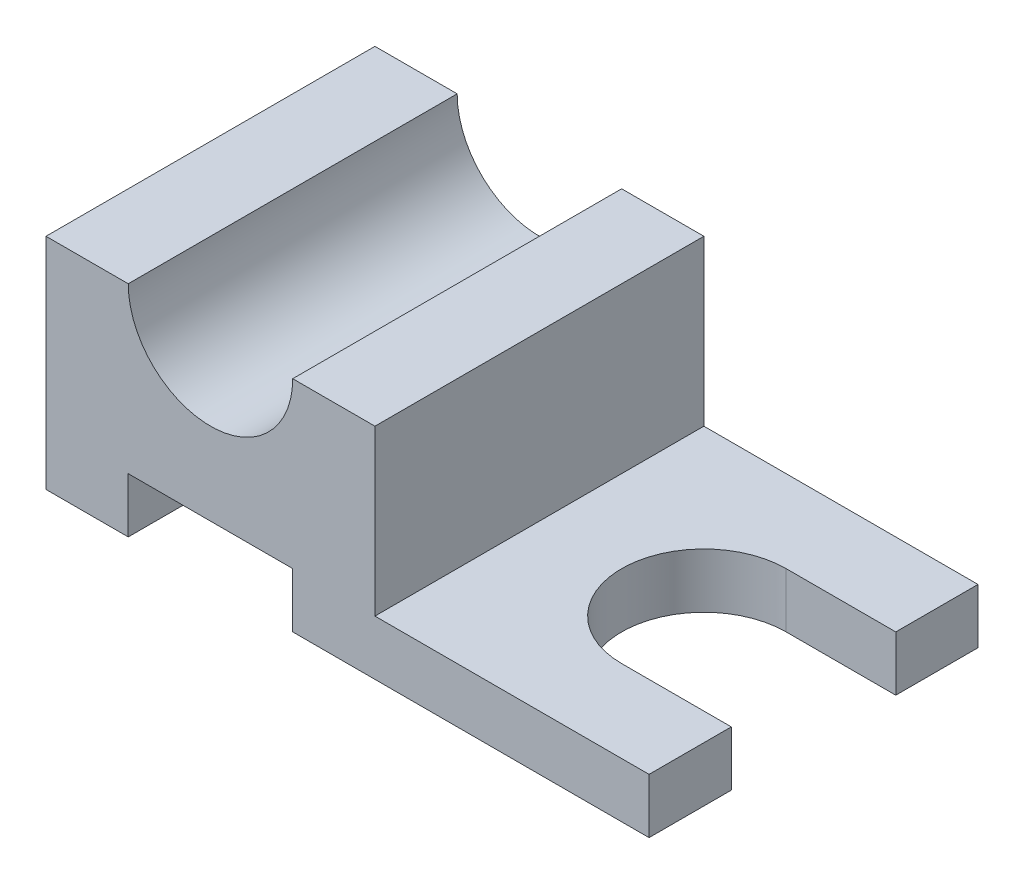
ISO-10303-21;
HEADER;
FILE_DESCRIPTION(('STEP AP214'),'2;1');
FILE_NAME('part.step','',(''),(''),'','','');
FILE_SCHEMA(('AUTOMOTIVE_DESIGN { 1 0 10303 214 1 1 1 1 }'));
ENDSEC;
DATA;
#1=APPLICATION_CONTEXT('core data for automotive mechanical design processes');
#2=APPLICATION_PROTOCOL_DEFINITION('international standard','automotive_design',2000,#1);
#3=PRODUCT_CONTEXT('',#1,'mechanical');
#4=PRODUCT('Part','Part','',(#3));
#5=PRODUCT_RELATED_PRODUCT_CATEGORY('part','',(#4));
#6=PRODUCT_DEFINITION_FORMATION('','',#4);
#7=PRODUCT_DEFINITION_CONTEXT('part definition',#1,'design');
#8=PRODUCT_DEFINITION('design','',#6,#7);
#9=PRODUCT_DEFINITION_SHAPE('','',#8);
#10=(LENGTH_UNIT() NAMED_UNIT(*) SI_UNIT(.MILLI.,.METRE.));
#11=(NAMED_UNIT(*) PLANE_ANGLE_UNIT() SI_UNIT($,.RADIAN.));
#12=(NAMED_UNIT(*) SI_UNIT($,.STERADIAN.) SOLID_ANGLE_UNIT());
#13=UNCERTAINTY_MEASURE_WITH_UNIT(LENGTH_MEASURE(1.E-05),#10,'distance_accuracy_value','');
#14=(GEOMETRIC_REPRESENTATION_CONTEXT(3) GLOBAL_UNCERTAINTY_ASSIGNED_CONTEXT((#13)) GLOBAL_UNIT_ASSIGNED_CONTEXT((#10,
#11,#12)) REPRESENTATION_CONTEXT('',''));
#15=CARTESIAN_POINT('',(0.,0.,0.));
#16=DIRECTION('',(0.,0.,1.));
#17=DIRECTION('',(1.,0.,0.));
#18=AXIS2_PLACEMENT_3D('',#15,#16,#17);
#19=CARTESIAN_POINT('',(-4.17454601462801,0.,60.));
#20=DIRECTION('',(-1.,0.,0.));
#21=DIRECTION('',(0.,0.,1.));
#22=AXIS2_PLACEMENT_3D('',#19,#20,#21);
#23=PLANE('',#22);
#24=DIRECTION('',(0.,0.,-1.));
#25=VECTOR('',#24,1.);
#26=CARTESIAN_POINT('',(-4.17454601462801,-48.7241840612872,60.));
#27=LINE('',#26,#25);
#28=CARTESIAN_POINT('',(-4.17454601462801,-48.7241840612872,15.));
#29=VERTEX_POINT('',#28);
#30=CARTESIAN_POINT('',(-4.17454601462801,-48.7241840612872,0.));
#31=VERTEX_POINT('',#30);
#32=EDGE_CURVE('E156',#29,#31,#27,.T.);
#33=ORIENTED_EDGE('',*,*,#32,.F.);
#34=DIRECTION('',(0.,1.,0.));
#35=VECTOR('',#34,1.);
#36=CARTESIAN_POINT('',(-4.17454601462801,-58.7241840612872,15.));
#37=LINE('',#36,#35);
#38=CARTESIAN_POINT('',(-4.17454601462801,-58.7241840612872,15.));
#39=VERTEX_POINT('',#38);
#40=EDGE_CURVE('E292',#39,#29,#37,.T.);
#41=ORIENTED_EDGE('',*,*,#40,.F.);
#42=DIRECTION('',(0.,0.,-1.));
#43=VECTOR('',#42,1.);
#44=CARTESIAN_POINT('',(-4.17454601462801,-58.7241840612872,60.));
#45=LINE('',#44,#43);
#46=CARTESIAN_POINT('',(-4.17454601462801,-58.7241840612872,0.));
#47=VERTEX_POINT('',#46);
#48=EDGE_CURVE('E201',#39,#47,#45,.T.);
#49=ORIENTED_EDGE('',*,*,#48,.T.);
#50=DIRECTION('',(0.,1.,0.));
#51=VECTOR('',#50,1.);
#52=CARTESIAN_POINT('',(-4.17454601462801,0.,0.));
#53=LINE('',#52,#51);
#54=EDGE_CURVE('E187',#47,#31,#53,.T.);
#55=ORIENTED_EDGE('',*,*,#54,.T.);
#56=EDGE_LOOP('',(#33,#41,#49,#55));
#57=FACE_BOUND('',#56,.T.);
#58=ADVANCED_FACE('F34',(#57),#23,.F.);
#59=CARTESIAN_POINT('',(-84.174546014628,-18.7241840612872,60.));
#60=DIRECTION('',(0.,0.,-1.));
#61=DIRECTION('',(-1.,0.,0.));
#62=AXIS2_PLACEMENT_3D('',#59,#60,#61);
#63=CYLINDRICAL_SURFACE('',#62,15.);
#64=CARTESIAN_POINT('',(-84.174546014628,-18.7241840612872,0.));
#65=DIRECTION('',(0.,0.,1.));
#66=DIRECTION('',(1.,0.,0.));
#67=AXIS2_PLACEMENT_3D('',#64,#65,#66);
#68=CIRCLE('',#67,15.);
#69=CARTESIAN_POINT('',(-99.174546014628,-18.7241840612872,0.));
#70=VERTEX_POINT('',#69);
#71=CARTESIAN_POINT('',(-69.174546014628,-18.7241840612872,0.));
#72=VERTEX_POINT('',#71);
#73=EDGE_CURVE('E165',#70,#72,#68,.T.);
#74=ORIENTED_EDGE('',*,*,#73,.F.);
#75=DIRECTION('',(0.,0.,-1.));
#76=VECTOR('',#75,1.);
#77=CARTESIAN_POINT('',(-99.174546014628,-18.7241840612872,60.));
#78=LINE('',#77,#76);
#79=CARTESIAN_POINT('',(-99.174546014628,-18.7241840612872,60.));
#80=VERTEX_POINT('',#79);
#81=EDGE_CURVE('E11',#80,#70,#78,.T.);
#82=ORIENTED_EDGE('',*,*,#81,.F.);
#83=CARTESIAN_POINT('',(-84.174546014628,-18.7241840612872,60.));
#84=DIRECTION('',(0.,0.,1.));
#85=DIRECTION('',(1.,0.,0.));
#86=AXIS2_PLACEMENT_3D('',#83,#84,#85);
#87=CIRCLE('',#86,15.);
#88=CARTESIAN_POINT('',(-69.174546014628,-18.7241840612872,60.));
#89=VERTEX_POINT('',#88);
#90=EDGE_CURVE('E196',#80,#89,#87,.T.);
#91=ORIENTED_EDGE('',*,*,#90,.T.);
#92=DIRECTION('',(0.,0.,-1.));
#93=VECTOR('',#92,1.);
#94=CARTESIAN_POINT('',(-69.174546014628,-18.7241840612872,60.));
#95=LINE('',#94,#93);
#96=EDGE_CURVE('E58',#89,#72,#95,.T.);
#97=ORIENTED_EDGE('',*,*,#96,.T.);
#98=EDGE_LOOP('',(#74,#82,#91,#97));
#99=FACE_BOUND('',#98,.T.);
#100=ADVANCED_FACE('F36',(#99),#63,.F.);
#101=CARTESIAN_POINT('',(0.,-18.7241840612872,60.));
#102=DIRECTION('',(0.,1.,0.));
#103=DIRECTION('',(0.,0.,1.));
#104=AXIS2_PLACEMENT_3D('',#101,#102,#103);
#105=PLANE('',#104);
#106=DIRECTION('',(1.,0.,0.));
#107=VECTOR('',#106,1.);
#108=CARTESIAN_POINT('',(0.,-18.7241840612872,0.));
#109=LINE('',#108,#107);
#110=CARTESIAN_POINT('',(-114.174546014628,-18.7241840612872,0.));
#111=VERTEX_POINT('',#110);
#112=EDGE_CURVE('E167',#111,#70,#109,.T.);
#113=ORIENTED_EDGE('',*,*,#112,.F.);
#114=DIRECTION('',(0.,0.,-1.));
#115=VECTOR('',#114,1.);
#116=CARTESIAN_POINT('',(-114.174546014628,-18.7241840612872,60.));
#117=LINE('',#116,#115);
#118=CARTESIAN_POINT('',(-114.174546014628,-18.7241840612872,60.));
#119=VERTEX_POINT('',#118);
#120=EDGE_CURVE('E42',#119,#111,#117,.T.);
#121=ORIENTED_EDGE('',*,*,#120,.F.);
#122=DIRECTION('',(1.,0.,0.));
#123=VECTOR('',#122,1.);
#124=CARTESIAN_POINT('',(0.,-18.7241840612872,60.));
#125=LINE('',#124,#123);
#126=EDGE_CURVE('E241',#119,#80,#125,.T.);
#127=ORIENTED_EDGE('',*,*,#126,.T.);
#128=ORIENTED_EDGE('',*,*,#81,.T.);
#129=EDGE_LOOP('',(#113,#121,#127,#128));
#130=FACE_BOUND('',#129,.T.);
#131=ADVANCED_FACE('F226',(#130),#105,.T.);
#132=CARTESIAN_POINT('',(-114.174546014628,0.,60.));
#133=DIRECTION('',(-1.,0.,0.));
#134=DIRECTION('',(0.,0.,1.));
#135=AXIS2_PLACEMENT_3D('',#132,#133,#134);
#136=PLANE('',#135);
#137=DIRECTION('',(0.,1.,0.));
#138=VECTOR('',#137,1.);
#139=CARTESIAN_POINT('',(-114.174546014628,0.,0.));
#140=LINE('',#139,#138);
#141=CARTESIAN_POINT('',(-114.174546014628,-58.7241840612872,0.));
#142=VERTEX_POINT('',#141);
#143=EDGE_CURVE('E171',#142,#111,#140,.T.);
#144=ORIENTED_EDGE('',*,*,#143,.F.);
#145=DIRECTION('',(0.,0.,-1.));
#146=VECTOR('',#145,1.);
#147=CARTESIAN_POINT('',(-114.174546014628,-58.7241840612872,60.));
#148=LINE('',#147,#146);
#149=CARTESIAN_POINT('',(-114.174546014628,-58.7241840612872,60.));
#150=VERTEX_POINT('',#149);
#151=EDGE_CURVE('E215',#150,#142,#148,.T.);
#152=ORIENTED_EDGE('',*,*,#151,.F.);
#153=DIRECTION('',(0.,1.,0.));
#154=VECTOR('',#153,1.);
#155=CARTESIAN_POINT('',(-114.174546014628,0.,60.));
#156=LINE('',#155,#154);
#157=EDGE_CURVE('E222',#150,#119,#156,.T.);
#158=ORIENTED_EDGE('',*,*,#157,.T.);
#159=ORIENTED_EDGE('',*,*,#120,.T.);
#160=EDGE_LOOP('',(#144,#152,#158,#159));
#161=FACE_BOUND('',#160,.T.);
#162=ADVANCED_FACE('F220',(#161),#136,.T.);
#163=CARTESIAN_POINT('',(0.,-58.7241840612872,60.));
#164=DIRECTION('',(0.,1.,0.));
#165=DIRECTION('',(0.,0.,1.));
#166=AXIS2_PLACEMENT_3D('',#163,#164,#165);
#167=PLANE('',#166);
#168=DIRECTION('',(1.,0.,0.));
#169=VECTOR('',#168,1.);
#170=CARTESIAN_POINT('',(0.,-58.7241840612872,0.));
#171=LINE('',#170,#169);
#172=CARTESIAN_POINT('',(-99.174546014628,-58.7241840612872,0.));
#173=VERTEX_POINT('',#172);
#174=EDGE_CURVE('E174',#142,#173,#171,.T.);
#175=ORIENTED_EDGE('',*,*,#174,.T.);
#176=DIRECTION('',(0.,0.,-1.));
#177=VECTOR('',#176,1.);
#178=CARTESIAN_POINT('',(-99.174546014628,-58.7241840612872,60.));
#179=LINE('',#178,#177);
#180=CARTESIAN_POINT('',(-99.174546014628,-58.7241840612872,60.));
#181=VERTEX_POINT('',#180);
#182=EDGE_CURVE('E213',#181,#173,#179,.T.);
#183=ORIENTED_EDGE('',*,*,#182,.F.);
#184=DIRECTION('',(1.,0.,0.));
#185=VECTOR('',#184,1.);
#186=CARTESIAN_POINT('',(0.,-58.7241840612872,60.));
#187=LINE('',#186,#185);
#188=EDGE_CURVE('E237',#150,#181,#187,.T.);
#189=ORIENTED_EDGE('',*,*,#188,.F.);
#190=ORIENTED_EDGE('',*,*,#151,.T.);
#191=EDGE_LOOP('',(#175,#183,#189,#190));
#192=FACE_BOUND('',#191,.T.);
#193=ADVANCED_FACE('F234',(#192),#167,.F.);
#194=CARTESIAN_POINT('',(-99.174546014628,0.,60.));
#195=DIRECTION('',(1.,0.,0.));
#196=DIRECTION('',(0.,0.,-1.));
#197=AXIS2_PLACEMENT_3D('',#194,#195,#196);
#198=PLANE('',#197);
#199=DIRECTION('',(0.,-1.,0.));
#200=VECTOR('',#199,1.);
#201=CARTESIAN_POINT('',(-99.174546014628,0.,0.));
#202=LINE('',#201,#200);
#203=CARTESIAN_POINT('',(-99.174546014628,-48.7241840612872,0.));
#204=VERTEX_POINT('',#203);
#205=EDGE_CURVE('E177',#204,#173,#202,.T.);
#206=ORIENTED_EDGE('',*,*,#205,.F.);
#207=DIRECTION('',(0.,0.,-1.));
#208=VECTOR('',#207,1.);
#209=CARTESIAN_POINT('',(-99.174546014628,-48.7241840612872,60.));
#210=LINE('',#209,#208);
#211=CARTESIAN_POINT('',(-99.174546014628,-48.7241840612872,60.));
#212=VERTEX_POINT('',#211);
#213=EDGE_CURVE('E211',#212,#204,#210,.T.);
#214=ORIENTED_EDGE('',*,*,#213,.F.);
#215=DIRECTION('',(0.,-1.,0.));
#216=VECTOR('',#215,1.);
#217=CARTESIAN_POINT('',(-99.174546014628,0.,60.));
#218=LINE('',#217,#216);
#219=EDGE_CURVE('E239',#212,#181,#218,.T.);
#220=ORIENTED_EDGE('',*,*,#219,.T.);
#221=ORIENTED_EDGE('',*,*,#182,.T.);
#222=EDGE_LOOP('',(#206,#214,#220,#221));
#223=FACE_BOUND('',#222,.T.);
#224=ADVANCED_FACE('F318',(#223),#198,.T.);
#225=CARTESIAN_POINT('',(0.,-48.7241840612872,60.));
#226=DIRECTION('',(0.,1.,0.));
#227=DIRECTION('',(0.,0.,1.));
#228=AXIS2_PLACEMENT_3D('',#225,#226,#227);
#229=PLANE('',#228);
#230=DIRECTION('',(1.,0.,0.));
#231=VECTOR('',#230,1.);
#232=CARTESIAN_POINT('',(0.,-48.7241840612872,0.));
#233=LINE('',#232,#231);
#234=CARTESIAN_POINT('',(-69.174546014628,-48.7241840612872,0.));
#235=VERTEX_POINT('',#234);
#236=EDGE_CURVE('E180',#204,#235,#233,.T.);
#237=ORIENTED_EDGE('',*,*,#236,.T.);
#238=DIRECTION('',(0.,0.,-1.));
#239=VECTOR('',#238,1.);
#240=CARTESIAN_POINT('',(-69.174546014628,-48.7241840612872,60.));
#241=LINE('',#240,#239);
#242=CARTESIAN_POINT('',(-69.174546014628,-48.7241840612872,60.));
#243=VERTEX_POINT('',#242);
#244=EDGE_CURVE('E208',#243,#235,#241,.T.);
#245=ORIENTED_EDGE('',*,*,#244,.F.);
#246=DIRECTION('',(1.,0.,0.));
#247=VECTOR('',#246,1.);
#248=CARTESIAN_POINT('',(0.,-48.7241840612872,60.));
#249=LINE('',#248,#247);
#250=EDGE_CURVE('E247',#212,#243,#249,.T.);
#251=ORIENTED_EDGE('',*,*,#250,.F.);
#252=ORIENTED_EDGE('',*,*,#213,.T.);
#253=EDGE_LOOP('',(#237,#245,#251,#252));
#254=FACE_BOUND('',#253,.T.);
#255=ADVANCED_FACE('F320',(#254),#229,.F.);
#256=CARTESIAN_POINT('',(-69.174546014628,0.,60.));
#257=DIRECTION('',(1.,0.,0.));
#258=DIRECTION('',(0.,0.,-1.));
#259=AXIS2_PLACEMENT_3D('',#256,#257,#258);
#260=PLANE('',#259);
#261=DIRECTION('',(0.,-1.,0.));
#262=VECTOR('',#261,1.);
#263=CARTESIAN_POINT('',(-69.174546014628,0.,0.));
#264=LINE('',#263,#262);
#265=CARTESIAN_POINT('',(-69.174546014628,-58.7241840612872,0.));
#266=VERTEX_POINT('',#265);
#267=EDGE_CURVE('E182',#235,#266,#264,.T.);
#268=ORIENTED_EDGE('',*,*,#267,.T.);
#269=DIRECTION('',(0.,0.,-1.));
#270=VECTOR('',#269,1.);
#271=CARTESIAN_POINT('',(-69.174546014628,-58.7241840612872,60.));
#272=LINE('',#271,#270);
#273=CARTESIAN_POINT('',(-69.174546014628,-58.7241840612872,60.));
#274=VERTEX_POINT('',#273);
#275=EDGE_CURVE('E205',#274,#266,#272,.T.);
#276=ORIENTED_EDGE('',*,*,#275,.F.);
#277=DIRECTION('',(0.,-1.,0.));
#278=VECTOR('',#277,1.);
#279=CARTESIAN_POINT('',(-69.174546014628,0.,60.));
#280=LINE('',#279,#278);
#281=EDGE_CURVE('E249',#243,#274,#280,.T.);
#282=ORIENTED_EDGE('',*,*,#281,.F.);
#283=ORIENTED_EDGE('',*,*,#244,.T.);
#284=EDGE_LOOP('',(#268,#276,#282,#283));
#285=FACE_BOUND('',#284,.T.);
#286=ADVANCED_FACE('F314',(#285),#260,.F.);
#287=CARTESIAN_POINT('',(0.,-58.7241840612872,60.));
#288=DIRECTION('',(0.,1.,0.));
#289=DIRECTION('',(0.,0.,1.));
#290=AXIS2_PLACEMENT_3D('',#287,#288,#289);
#291=PLANE('',#290);
#292=ORIENTED_EDGE('',*,*,#48,.F.);
#293=DIRECTION('',(-1.,0.,0.));
#294=VECTOR('',#293,1.);
#295=CARTESIAN_POINT('',(-24.174546014628,-58.7241840612872,15.));
#296=LINE('',#295,#294);
#297=CARTESIAN_POINT('',(-24.174546014628,-58.7241840612872,15.));
#298=VERTEX_POINT('',#297);
#299=EDGE_CURVE('E303',#39,#298,#296,.T.);
#300=ORIENTED_EDGE('',*,*,#299,.T.);
#301=CARTESIAN_POINT('',(-24.174546014628,-58.7241840612872,30.));
#302=DIRECTION('',(0.,1.,0.));
#303=DIRECTION('',(0.,0.,1.));
#304=AXIS2_PLACEMENT_3D('',#301,#302,#303);
#305=CIRCLE('',#304,15.);
#306=CARTESIAN_POINT('',(-24.174546014628,-58.7241840612872,45.));
#307=VERTEX_POINT('',#306);
#308=EDGE_CURVE('E289',#298,#307,#305,.T.);
#309=ORIENTED_EDGE('',*,*,#308,.T.);
#310=DIRECTION('',(1.,0.,0.));
#311=VECTOR('',#310,1.);
#312=CARTESIAN_POINT('',(-24.174546014628,-58.7241840612872,45.));
#313=LINE('',#312,#311);
#314=CARTESIAN_POINT('',(-4.17454601462801,-58.7241840612872,45.));
#315=VERTEX_POINT('',#314);
#316=EDGE_CURVE('E263',#307,#315,#313,.T.);
#317=ORIENTED_EDGE('',*,*,#316,.T.);
#318=CARTESIAN_POINT('',(-4.17454601462801,-58.7241840612872,60.));
#319=VERTEX_POINT('',#318);
#320=EDGE_CURVE('E202',#319,#315,#45,.T.);
#321=ORIENTED_EDGE('',*,*,#320,.F.);
#322=DIRECTION('',(1.,0.,0.));
#323=VECTOR('',#322,1.);
#324=CARTESIAN_POINT('',(0.,-58.7241840612872,60.));
#325=LINE('',#324,#323);
#326=EDGE_CURVE('E251',#274,#319,#325,.T.);
#327=ORIENTED_EDGE('',*,*,#326,.F.);
#328=ORIENTED_EDGE('',*,*,#275,.T.);
#329=DIRECTION('',(1.,0.,0.));
#330=VECTOR('',#329,1.);
#331=CARTESIAN_POINT('',(0.,-58.7241840612872,0.));
#332=LINE('',#331,#330);
#333=EDGE_CURVE('E184',#266,#47,#332,.T.);
#334=ORIENTED_EDGE('',*,*,#333,.T.);
#335=EDGE_LOOP('',(#292,#300,#309,#317,#321,#327,#328,#334));
#336=FACE_BOUND('',#335,.T.);
#337=ADVANCED_FACE('F259',(#336),#291,.F.);
#338=ORIENTED_EDGE('',*,*,#320,.T.);
#339=DIRECTION('',(0.,1.,0.));
#340=VECTOR('',#339,1.);
#341=CARTESIAN_POINT('',(-4.17454601462801,-58.7241840612872,45.));
#342=LINE('',#341,#340);
#343=CARTESIAN_POINT('',(-4.17454601462801,-48.7241840612872,45.));
#344=VERTEX_POINT('',#343);
#345=EDGE_CURVE('E269',#315,#344,#342,.T.);
#346=ORIENTED_EDGE('',*,*,#345,.T.);
#347=CARTESIAN_POINT('',(-4.17454601462801,-48.7241840612872,60.));
#348=VERTEX_POINT('',#347);
#349=EDGE_CURVE('E199',#348,#344,#27,.T.);
#350=ORIENTED_EDGE('',*,*,#349,.F.);
#351=DIRECTION('',(0.,1.,0.));
#352=VECTOR('',#351,1.);
#353=CARTESIAN_POINT('',(-4.17454601462801,0.,60.));
#354=LINE('',#353,#352);
#355=EDGE_CURVE('E143',#319,#348,#354,.T.);
#356=ORIENTED_EDGE('',*,*,#355,.F.);
#357=EDGE_LOOP('',(#338,#346,#350,#356));
#358=FACE_BOUND('',#357,.T.);
#359=ADVANCED_FACE('F266',(#358),#23,.F.);
#360=CARTESIAN_POINT('',(0.,-48.7241840612872,60.));
#361=DIRECTION('',(0.,-1.,0.));
#362=DIRECTION('',(0.,0.,-1.));
#363=AXIS2_PLACEMENT_3D('',#360,#361,#362);
#364=PLANE('',#363);
#365=CARTESIAN_POINT('',(-24.174546014628,-48.7241840612872,30.));
#366=DIRECTION('',(0.,1.,0.));
#367=DIRECTION('',(0.,0.,1.));
#368=AXIS2_PLACEMENT_3D('',#365,#366,#367);
#369=CIRCLE('',#368,15.);
#370=CARTESIAN_POINT('',(-24.174546014628,-48.7241840612872,15.));
#371=VERTEX_POINT('',#370);
#372=CARTESIAN_POINT('',(-24.174546014628,-48.7241840612872,45.));
#373=VERTEX_POINT('',#372);
#374=EDGE_CURVE('E49',#371,#373,#369,.T.);
#375=ORIENTED_EDGE('',*,*,#374,.F.);
#376=DIRECTION('',(-1.,0.,0.));
#377=VECTOR('',#376,1.);
#378=CARTESIAN_POINT('',(-24.174546014628,-48.7241840612872,15.));
#379=LINE('',#378,#377);
#380=EDGE_CURVE('E295',#29,#371,#379,.T.);
#381=ORIENTED_EDGE('',*,*,#380,.F.);
#382=ORIENTED_EDGE('',*,*,#32,.T.);
#383=DIRECTION('',(-1.,0.,0.));
#384=VECTOR('',#383,1.);
#385=CARTESIAN_POINT('',(0.,-48.7241840612872,0.));
#386=LINE('',#385,#384);
#387=CARTESIAN_POINT('',(-54.174546014628,-48.7241840612872,0.));
#388=VERTEX_POINT('',#387);
#389=EDGE_CURVE('E152',#31,#388,#386,.T.);
#390=ORIENTED_EDGE('',*,*,#389,.T.);
#391=DIRECTION('',(0.,0.,-1.));
#392=VECTOR('',#391,1.);
#393=CARTESIAN_POINT('',(-54.174546014628,-48.7241840612872,60.));
#394=LINE('',#393,#392);
#395=CARTESIAN_POINT('',(-54.174546014628,-48.7241840612872,60.));
#396=VERTEX_POINT('',#395);
#397=EDGE_CURVE('E149',#396,#388,#394,.T.);
#398=ORIENTED_EDGE('',*,*,#397,.F.);
#399=DIRECTION('',(-1.,0.,0.));
#400=VECTOR('',#399,1.);
#401=CARTESIAN_POINT('',(0.,-48.7241840612872,60.));
#402=LINE('',#401,#400);
#403=EDGE_CURVE('E136',#348,#396,#402,.T.);
#404=ORIENTED_EDGE('',*,*,#403,.F.);
#405=ORIENTED_EDGE('',*,*,#349,.T.);
#406=DIRECTION('',(1.,0.,0.));
#407=VECTOR('',#406,1.);
#408=CARTESIAN_POINT('',(-24.174546014628,-48.7241840612872,45.));
#409=LINE('',#408,#407);
#410=EDGE_CURVE('E272',#373,#344,#409,.T.);
#411=ORIENTED_EDGE('',*,*,#410,.F.);
#412=EDGE_LOOP('',(#375,#381,#382,#390,#398,#404,#405,#411));
#413=FACE_BOUND('',#412,.T.);
#414=ADVANCED_FACE('F150',(#413),#364,.F.);
#415=CARTESIAN_POINT('',(-54.174546014628,0.,60.));
#416=DIRECTION('',(1.,0.,0.));
#417=DIRECTION('',(0.,0.,-1.));
#418=AXIS2_PLACEMENT_3D('',#415,#416,#417);
#419=PLANE('',#418);
#420=DIRECTION('',(0.,-1.,0.));
#421=VECTOR('',#420,1.);
#422=CARTESIAN_POINT('',(-54.174546014628,0.,0.));
#423=LINE('',#422,#421);
#424=CARTESIAN_POINT('',(-54.174546014628,-18.7241840612872,0.));
#425=VERTEX_POINT('',#424);
#426=EDGE_CURVE('E191',#425,#388,#423,.T.);
#427=ORIENTED_EDGE('',*,*,#426,.F.);
#428=DIRECTION('',(0.,0.,-1.));
#429=VECTOR('',#428,1.);
#430=CARTESIAN_POINT('',(-54.174546014628,-18.7241840612872,60.));
#431=LINE('',#430,#429);
#432=CARTESIAN_POINT('',(-54.174546014628,-18.7241840612872,60.));
#433=VERTEX_POINT('',#432);
#434=EDGE_CURVE('E157',#433,#425,#431,.T.);
#435=ORIENTED_EDGE('',*,*,#434,.F.);
#436=DIRECTION('',(0.,-1.,0.));
#437=VECTOR('',#436,1.);
#438=CARTESIAN_POINT('',(-54.174546014628,0.,60.));
#439=LINE('',#438,#437);
#440=EDGE_CURVE('E141',#433,#396,#439,.T.);
#441=ORIENTED_EDGE('',*,*,#440,.T.);
#442=ORIENTED_EDGE('',*,*,#397,.T.);
#443=EDGE_LOOP('',(#427,#435,#441,#442));
#444=FACE_BOUND('',#443,.T.);
#445=ADVANCED_FACE('F159',(#444),#419,.T.);
#446=CARTESIAN_POINT('',(0.,-18.7241840612872,60.));
#447=DIRECTION('',(0.,1.,0.));
#448=DIRECTION('',(0.,0.,1.));
#449=AXIS2_PLACEMENT_3D('',#446,#447,#448);
#450=PLANE('',#449);
#451=DIRECTION('',(1.,0.,0.));
#452=VECTOR('',#451,1.);
#453=CARTESIAN_POINT('',(0.,-18.7241840612872,0.));
#454=LINE('',#453,#452);
#455=EDGE_CURVE('E193',#72,#425,#454,.T.);
#456=ORIENTED_EDGE('',*,*,#455,.F.);
#457=ORIENTED_EDGE('',*,*,#96,.F.);
#458=DIRECTION('',(1.,0.,0.));
#459=VECTOR('',#458,1.);
#460=CARTESIAN_POINT('',(0.,-18.7241840612872,60.));
#461=LINE('',#460,#459);
#462=EDGE_CURVE('E160',#89,#433,#461,.T.);
#463=ORIENTED_EDGE('',*,*,#462,.T.);
#464=ORIENTED_EDGE('',*,*,#434,.T.);
#465=EDGE_LOOP('',(#456,#457,#463,#464));
#466=FACE_BOUND('',#465,.T.);
#467=ADVANCED_FACE('F308',(#466),#450,.T.);
#468=CARTESIAN_POINT('',(0.,0.,60.));
#469=DIRECTION('',(0.,0.,1.));
#470=DIRECTION('',(1.,0.,0.));
#471=AXIS2_PLACEMENT_3D('',#468,#469,#470);
#472=PLANE('',#471);
#473=ORIENTED_EDGE('',*,*,#90,.F.);
#474=ORIENTED_EDGE('',*,*,#126,.F.);
#475=ORIENTED_EDGE('',*,*,#157,.F.);
#476=ORIENTED_EDGE('',*,*,#188,.T.);
#477=ORIENTED_EDGE('',*,*,#219,.F.);
#478=ORIENTED_EDGE('',*,*,#250,.T.);
#479=ORIENTED_EDGE('',*,*,#281,.T.);
#480=ORIENTED_EDGE('',*,*,#326,.T.);
#481=ORIENTED_EDGE('',*,*,#355,.T.);
#482=ORIENTED_EDGE('',*,*,#403,.T.);
#483=ORIENTED_EDGE('',*,*,#440,.F.);
#484=ORIENTED_EDGE('',*,*,#462,.F.);
#485=EDGE_LOOP('',(#473,#474,#475,#476,#477,#478,#479,#480,#481,#482,#483,#484));
#486=FACE_BOUND('',#485,.T.);
#487=ADVANCED_FACE('F138',(#486),#472,.T.);
#488=CARTESIAN_POINT('',(0.,0.,0.));
#489=DIRECTION('',(0.,0.,1.));
#490=DIRECTION('',(1.,0.,0.));
#491=AXIS2_PLACEMENT_3D('',#488,#489,#490);
#492=PLANE('',#491);
#493=ORIENTED_EDGE('',*,*,#73,.T.);
#494=ORIENTED_EDGE('',*,*,#455,.T.);
#495=ORIENTED_EDGE('',*,*,#426,.T.);
#496=ORIENTED_EDGE('',*,*,#389,.F.);
#497=ORIENTED_EDGE('',*,*,#54,.F.);
#498=ORIENTED_EDGE('',*,*,#333,.F.);
#499=ORIENTED_EDGE('',*,*,#267,.F.);
#500=ORIENTED_EDGE('',*,*,#236,.F.);
#501=ORIENTED_EDGE('',*,*,#205,.T.);
#502=ORIENTED_EDGE('',*,*,#174,.F.);
#503=ORIENTED_EDGE('',*,*,#143,.T.);
#504=ORIENTED_EDGE('',*,*,#112,.T.);
#505=EDGE_LOOP('',(#493,#494,#495,#496,#497,#498,#499,#500,#501,#502,#503,#504));
#506=FACE_BOUND('',#505,.T.);
#507=ADVANCED_FACE('F229',(#506),#492,.F.);
#508=CARTESIAN_POINT('',(-24.174546014628,-58.7241840612872,30.));
#509=DIRECTION('',(0.,1.,0.));
#510=DIRECTION('',(0.,0.,1.));
#511=AXIS2_PLACEMENT_3D('',#508,#509,#510);
#512=CYLINDRICAL_SURFACE('',#511,15.);
#513=ORIENTED_EDGE('',*,*,#374,.T.);
#514=DIRECTION('',(0.,1.,0.));
#515=VECTOR('',#514,1.);
#516=CARTESIAN_POINT('',(-24.174546014628,-58.7241840612872,45.));
#517=LINE('',#516,#515);
#518=EDGE_CURVE('E286',#307,#373,#517,.T.);
#519=ORIENTED_EDGE('',*,*,#518,.F.);
#520=ORIENTED_EDGE('',*,*,#308,.F.);
#521=DIRECTION('',(0.,1.,0.));
#522=VECTOR('',#521,1.);
#523=CARTESIAN_POINT('',(-24.174546014628,-58.7241840612872,15.));
#524=LINE('',#523,#522);
#525=EDGE_CURVE('E168',#298,#371,#524,.T.);
#526=ORIENTED_EDGE('',*,*,#525,.T.);
#527=EDGE_LOOP('',(#513,#519,#520,#526));
#528=FACE_BOUND('',#527,.T.);
#529=ADVANCED_FACE('F288',(#528),#512,.F.);
#530=CARTESIAN_POINT('',(-24.174546014628,-58.7241840612872,15.));
#531=DIRECTION('',(0.,0.,-1.));
#532=DIRECTION('',(-1.,0.,0.));
#533=AXIS2_PLACEMENT_3D('',#530,#531,#532);
#534=PLANE('',#533);
#535=ORIENTED_EDGE('',*,*,#380,.T.);
#536=ORIENTED_EDGE('',*,*,#525,.F.);
#537=ORIENTED_EDGE('',*,*,#299,.F.);
#538=ORIENTED_EDGE('',*,*,#40,.T.);
#539=EDGE_LOOP('',(#535,#536,#537,#538));
#540=FACE_BOUND('',#539,.T.);
#541=ADVANCED_FACE('F296',(#540),#534,.F.);
#542=CARTESIAN_POINT('',(-24.174546014628,-58.7241840612872,45.));
#543=DIRECTION('',(0.,0.,1.));
#544=DIRECTION('',(1.,0.,0.));
#545=AXIS2_PLACEMENT_3D('',#542,#543,#544);
#546=PLANE('',#545);
#547=ORIENTED_EDGE('',*,*,#410,.T.);
#548=ORIENTED_EDGE('',*,*,#345,.F.);
#549=ORIENTED_EDGE('',*,*,#316,.F.);
#550=ORIENTED_EDGE('',*,*,#518,.T.);
#551=EDGE_LOOP('',(#547,#548,#549,#550));
#552=FACE_BOUND('',#551,.T.);
#553=ADVANCED_FACE('F405',(#552),#546,.F.);
#554=CLOSED_SHELL('',(#58,#100,#131,#162,#193,#224,#255,#286,#337,#359,#414,#445,#467,#487,#507,
#529,#541,#553));
#555=MANIFOLD_SOLID_BREP('B2',#554);
#556=ADVANCED_BREP_SHAPE_REPRESENTATION('',(#18,#555),#14);
#557=SHAPE_DEFINITION_REPRESENTATION(#9,#556);
ENDSEC;
END-ISO-10303-21;
